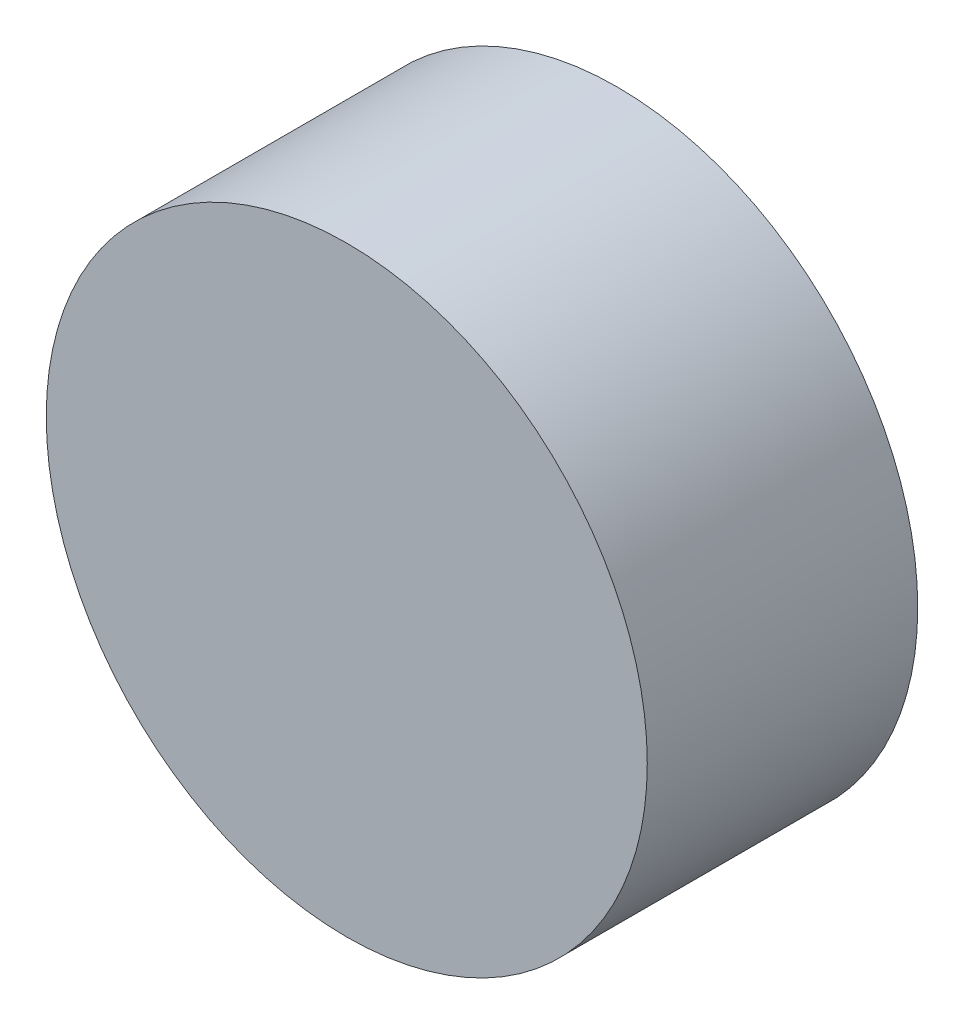
ISO-10303-21;
HEADER;
FILE_DESCRIPTION(('STEP AP214'),'2;1');
FILE_NAME('part.step','',(''),(''),'','','');
FILE_SCHEMA(('AUTOMOTIVE_DESIGN { 1 0 10303 214 1 1 1 1 }'));
ENDSEC;
DATA;
#1=APPLICATION_CONTEXT('core data for automotive mechanical design processes');
#2=APPLICATION_PROTOCOL_DEFINITION('international standard','automotive_design',2000,#1);
#3=PRODUCT_CONTEXT('',#1,'mechanical');
#4=PRODUCT('Part','Part','',(#3));
#5=PRODUCT_RELATED_PRODUCT_CATEGORY('part','',(#4));
#6=PRODUCT_DEFINITION_FORMATION('','',#4);
#7=PRODUCT_DEFINITION_CONTEXT('part definition',#1,'design');
#8=PRODUCT_DEFINITION('design','',#6,#7);
#9=PRODUCT_DEFINITION_SHAPE('','',#8);
#10=(LENGTH_UNIT() NAMED_UNIT(*) SI_UNIT(.MILLI.,.METRE.));
#11=(NAMED_UNIT(*) PLANE_ANGLE_UNIT() SI_UNIT($,.RADIAN.));
#12=(NAMED_UNIT(*) SI_UNIT($,.STERADIAN.) SOLID_ANGLE_UNIT());
#13=UNCERTAINTY_MEASURE_WITH_UNIT(LENGTH_MEASURE(1.E-05),#10,'distance_accuracy_value','');
#14=(GEOMETRIC_REPRESENTATION_CONTEXT(3) GLOBAL_UNCERTAINTY_ASSIGNED_CONTEXT((#13)) GLOBAL_UNIT_ASSIGNED_CONTEXT((#10,
#11,#12)) REPRESENTATION_CONTEXT('',''));
#15=CARTESIAN_POINT('',(0.,0.,0.));
#16=DIRECTION('',(0.,0.,1.));
#17=DIRECTION('',(1.,0.,0.));
#18=AXIS2_PLACEMENT_3D('',#15,#16,#17);
#19=CARTESIAN_POINT('',(0.,0.,0.));
#20=DIRECTION('',(0.,0.,-1.));
#21=DIRECTION('',(0.,-1.,0.));
#22=AXIS2_PLACEMENT_3D('',#19,#20,#21);
#23=PLANE('',#22);
#24=CARTESIAN_POINT('',(0.,0.,0.));
#25=DIRECTION('',(0.,0.,1.));
#26=DIRECTION('',(1.,0.,0.));
#27=AXIS2_PLACEMENT_3D('',#24,#25,#26);
#28=CIRCLE('',#27,3.5);
#29=CARTESIAN_POINT('',(3.5,0.,0.));
#30=VERTEX_POINT('',#29);
#31=EDGE_CURVE('E27',#30,#30,#28,.T.);
#32=ORIENTED_EDGE('',*,*,#31,.F.);
#33=EDGE_LOOP('',(#32));
#34=FACE_BOUND('',#33,.T.);
#35=ADVANCED_FACE('F16',(#34),#23,.T.);
#36=CARTESIAN_POINT('',(0.,0.,0.1));
#37=DIRECTION('',(0.,0.,1.));
#38=DIRECTION('',(1.,0.,0.));
#39=AXIS2_PLACEMENT_3D('',#36,#37,#38);
#40=PLANE('',#39);
#41=CARTESIAN_POINT('',(0.,0.,0.1));
#42=DIRECTION('',(0.,0.,1.));
#43=DIRECTION('',(1.,0.,0.));
#44=AXIS2_PLACEMENT_3D('',#41,#42,#43);
#45=CIRCLE('',#44,9.);
#46=CARTESIAN_POINT('',(9.,0.,0.1));
#47=VERTEX_POINT('',#46);
#48=EDGE_CURVE('E11',#47,#47,#45,.T.);
#49=ORIENTED_EDGE('',*,*,#48,.F.);
#50=EDGE_LOOP('',(#49));
#51=FACE_BOUND('',#50,.T.);
#52=CARTESIAN_POINT('',(0.,0.,0.1));
#53=DIRECTION('',(0.,0.,1.));
#54=DIRECTION('',(1.,0.,0.));
#55=AXIS2_PLACEMENT_3D('',#52,#53,#54);
#56=CIRCLE('',#55,3.5);
#57=CARTESIAN_POINT('',(3.5,0.,0.1));
#58=VERTEX_POINT('',#57);
#59=EDGE_CURVE('E70',#58,#58,#56,.T.);
#60=ORIENTED_EDGE('',*,*,#59,.T.);
#61=EDGE_LOOP('',(#60));
#62=FACE_BOUND('',#61,.T.);
#63=ADVANCED_FACE('F18',(#51,#62),#40,.F.);
#64=CARTESIAN_POINT('',(0.,0.,0.1));
#65=DIRECTION('',(0.,0.,-1.));
#66=DIRECTION('',(-1.,0.,0.));
#67=AXIS2_PLACEMENT_3D('',#64,#65,#66);
#68=CYLINDRICAL_SURFACE('',#67,9.);
#69=CARTESIAN_POINT('',(0.,0.,0.));
#70=DIRECTION('',(0.,0.,1.));
#71=DIRECTION('',(1.,0.,0.));
#72=AXIS2_PLACEMENT_3D('',#69,#70,#71);
#73=CIRCLE('',#72,9.);
#74=CARTESIAN_POINT('',(9.,0.,0.));
#75=VERTEX_POINT('',#74);
#76=EDGE_CURVE('E20',#75,#75,#73,.T.);
#77=ORIENTED_EDGE('',*,*,#76,.F.);
#78=EDGE_LOOP('',(#77));
#79=FACE_BOUND('',#78,.T.);
#80=ORIENTED_EDGE('',*,*,#48,.T.);
#81=EDGE_LOOP('',(#80));
#82=FACE_BOUND('',#81,.T.);
#83=ADVANCED_FACE('F81',(#79,#82),#68,.F.);
#84=CARTESIAN_POINT('',(0.,0.,0.1));
#85=DIRECTION('',(0.,0.,-1.));
#86=DIRECTION('',(-1.,0.,0.));
#87=AXIS2_PLACEMENT_3D('',#84,#85,#86);
#88=CYLINDRICAL_SURFACE('',#87,3.5);
#89=ORIENTED_EDGE('',*,*,#31,.T.);
#90=EDGE_LOOP('',(#89));
#91=FACE_BOUND('',#90,.T.);
#92=ORIENTED_EDGE('',*,*,#59,.F.);
#93=EDGE_LOOP('',(#92));
#94=FACE_BOUND('',#93,.T.);
#95=ADVANCED_FACE('F83',(#91,#94),#88,.T.);
#96=CARTESIAN_POINT('',(0.,0.,0.));
#97=DIRECTION('',(0.,0.,-1.));
#98=DIRECTION('',(0.,-1.,0.));
#99=AXIS2_PLACEMENT_3D('',#96,#97,#98);
#100=PLANE('',#99);
#101=CARTESIAN_POINT('',(0.,0.,0.));
#102=DIRECTION('',(0.,0.,-1.));
#103=DIRECTION('',(1.,0.,0.));
#104=AXIS2_PLACEMENT_3D('',#101,#102,#103);
#105=CIRCLE('',#104,10.);
#106=CARTESIAN_POINT('',(10.,0.,0.));
#107=VERTEX_POINT('',#106);
#108=EDGE_CURVE('E50',#107,#107,#105,.T.);
#109=ORIENTED_EDGE('',*,*,#108,.T.);
#110=EDGE_LOOP('',(#109));
#111=FACE_BOUND('',#110,.T.);
#112=ORIENTED_EDGE('',*,*,#76,.T.);
#113=EDGE_LOOP('',(#112));
#114=FACE_BOUND('',#113,.T.);
#115=ADVANCED_FACE('F79',(#111,#114),#100,.T.);
#116=CARTESIAN_POINT('',(0.,0.,9.));
#117=DIRECTION('',(0.,0.,-1.));
#118=DIRECTION('',(0.,-1.,0.));
#119=AXIS2_PLACEMENT_3D('',#116,#117,#118);
#120=PLANE('',#119);
#121=CARTESIAN_POINT('',(0.,0.,9.));
#122=DIRECTION('',(0.,0.,-1.));
#123=DIRECTION('',(1.,0.,0.));
#124=AXIS2_PLACEMENT_3D('',#121,#122,#123);
#125=CIRCLE('',#124,10.);
#126=CARTESIAN_POINT('',(10.,0.,9.));
#127=VERTEX_POINT('',#126);
#128=EDGE_CURVE('E58',#127,#127,#125,.T.);
#129=ORIENTED_EDGE('',*,*,#128,.F.);
#130=EDGE_LOOP('',(#129));
#131=FACE_BOUND('',#130,.T.);
#132=ADVANCED_FACE('F100',(#131),#120,.F.);
#133=CARTESIAN_POINT('',(0.,0.,10.));
#134=DIRECTION('',(0.,0.,-1.));
#135=DIRECTION('',(-1.,0.,0.));
#136=AXIS2_PLACEMENT_3D('',#133,#134,#135);
#137=CYLINDRICAL_SURFACE('',#136,10.);
#138=ORIENTED_EDGE('',*,*,#108,.F.);
#139=EDGE_LOOP('',(#138));
#140=FACE_BOUND('',#139,.T.);
#141=ORIENTED_EDGE('',*,*,#128,.T.);
#142=EDGE_LOOP('',(#141));
#143=FACE_BOUND('',#142,.T.);
#144=ADVANCED_FACE('F59',(#140,#143),#137,.T.);
#145=CLOSED_SHELL('',(#35,#63,#83,#95,#115,#132,#144));
#146=MANIFOLD_SOLID_BREP('B1',#145);
#147=ADVANCED_BREP_SHAPE_REPRESENTATION('',(#18,#146),#14);
#148=SHAPE_DEFINITION_REPRESENTATION(#9,#147);
ENDSEC;
END-ISO-10303-21;
